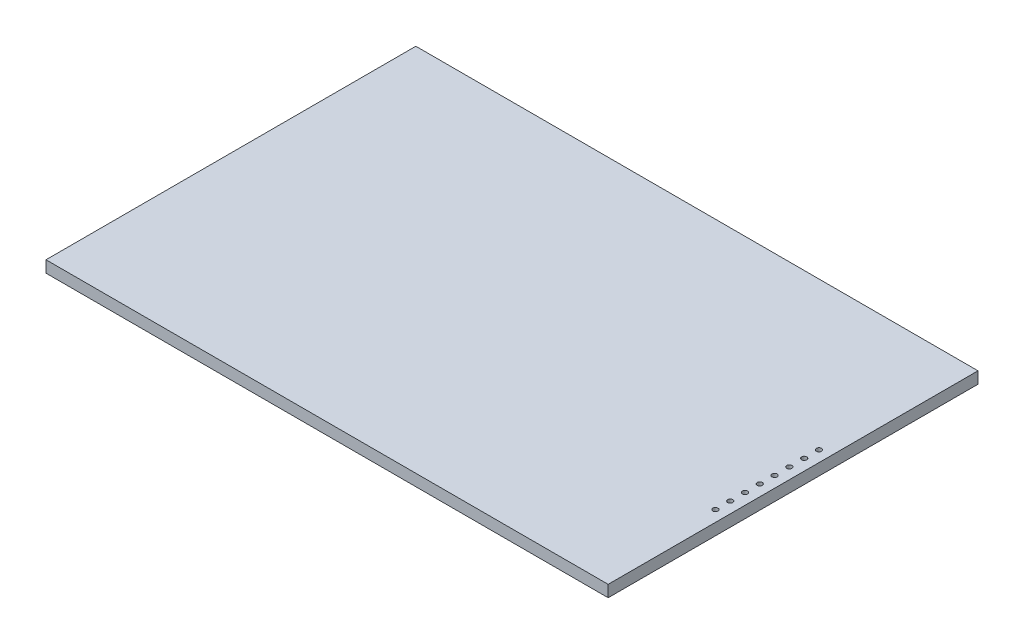
ISO-10303-21;
HEADER;
FILE_DESCRIPTION(('STEP AP214'),'2;1');
FILE_NAME('part.step','',(''),(''),'','','');
FILE_SCHEMA(('AUTOMOTIVE_DESIGN { 1 0 10303 214 1 1 1 1 }'));
ENDSEC;
DATA;
#1=APPLICATION_CONTEXT('core data for automotive mechanical design processes');
#2=APPLICATION_PROTOCOL_DEFINITION('international standard','automotive_design',2000,#1);
#3=PRODUCT_CONTEXT('',#1,'mechanical');
#4=PRODUCT('Part','Part','',(#3));
#5=PRODUCT_RELATED_PRODUCT_CATEGORY('part','',(#4));
#6=PRODUCT_DEFINITION_FORMATION('','',#4);
#7=PRODUCT_DEFINITION_CONTEXT('part definition',#1,'design');
#8=PRODUCT_DEFINITION('design','',#6,#7);
#9=PRODUCT_DEFINITION_SHAPE('','',#8);
#10=(LENGTH_UNIT() NAMED_UNIT(*) SI_UNIT(.MILLI.,.METRE.));
#11=(NAMED_UNIT(*) PLANE_ANGLE_UNIT() SI_UNIT($,.RADIAN.));
#12=(NAMED_UNIT(*) SI_UNIT($,.STERADIAN.) SOLID_ANGLE_UNIT());
#13=UNCERTAINTY_MEASURE_WITH_UNIT(LENGTH_MEASURE(1.E-05),#10,'distance_accuracy_value','');
#14=(GEOMETRIC_REPRESENTATION_CONTEXT(3) GLOBAL_UNCERTAINTY_ASSIGNED_CONTEXT((#13)) GLOBAL_UNIT_ASSIGNED_CONTEXT((#10,
#11,#12)) REPRESENTATION_CONTEXT('',''));
#15=CARTESIAN_POINT('',(0.,0.,0.));
#16=DIRECTION('',(0.,0.,1.));
#17=DIRECTION('',(1.,0.,0.));
#18=AXIS2_PLACEMENT_3D('',#15,#16,#17);
#19=CARTESIAN_POINT('',(0.,2.,0.));
#20=DIRECTION('',(-1.,0.,0.));
#21=DIRECTION('',(0.,0.,1.));
#22=AXIS2_PLACEMENT_3D('',#19,#20,#21);
#23=PLANE('',#22);
#24=DIRECTION('',(0.,0.,-1.));
#25=VECTOR('',#24,1.);
#26=CARTESIAN_POINT('',(0.,0.,0.));
#27=LINE('',#26,#25);
#28=CARTESIAN_POINT('',(0.,0.,0.));
#29=VERTEX_POINT('',#28);
#30=CARTESIAN_POINT('',(0.,0.,-63.5));
#31=VERTEX_POINT('',#30);
#32=EDGE_CURVE('E98',#29,#31,#27,.T.);
#33=ORIENTED_EDGE('',*,*,#32,.T.);
#34=DIRECTION('',(0.,-1.,0.));
#35=VECTOR('',#34,1.);
#36=CARTESIAN_POINT('',(0.,2.,-63.5));
#37=LINE('',#36,#35);
#38=CARTESIAN_POINT('',(0.,2.,-63.5));
#39=VERTEX_POINT('',#38);
#40=EDGE_CURVE('E11',#39,#31,#37,.T.);
#41=ORIENTED_EDGE('',*,*,#40,.F.);
#42=DIRECTION('',(0.,0.,-1.));
#43=VECTOR('',#42,1.);
#44=CARTESIAN_POINT('',(0.,2.,0.));
#45=LINE('',#44,#43);
#46=CARTESIAN_POINT('',(0.,2.,0.));
#47=VERTEX_POINT('',#46);
#48=EDGE_CURVE('E86',#47,#39,#45,.T.);
#49=ORIENTED_EDGE('',*,*,#48,.F.);
#50=DIRECTION('',(0.,-1.,0.));
#51=VECTOR('',#50,1.);
#52=CARTESIAN_POINT('',(0.,2.,0.));
#53=LINE('',#52,#51);
#54=EDGE_CURVE('E94',#47,#29,#53,.T.);
#55=ORIENTED_EDGE('',*,*,#54,.T.);
#56=EDGE_LOOP('',(#33,#41,#49,#55));
#57=FACE_BOUND('',#56,.T.);
#58=ADVANCED_FACE('F35',(#57),#23,.F.);
#59=CARTESIAN_POINT('',(0.,2.,-63.5));
#60=DIRECTION('',(0.,0.,1.));
#61=DIRECTION('',(1.,0.,0.));
#62=AXIS2_PLACEMENT_3D('',#59,#60,#61);
#63=PLANE('',#62);
#64=DIRECTION('',(-1.,0.,0.));
#65=VECTOR('',#64,1.);
#66=CARTESIAN_POINT('',(0.,0.,-63.5));
#67=LINE('',#66,#65);
#68=CARTESIAN_POINT('',(-96.52,0.,-63.5));
#69=VERTEX_POINT('',#68);
#70=EDGE_CURVE('E90',#31,#69,#67,.T.);
#71=ORIENTED_EDGE('',*,*,#70,.T.);
#72=DIRECTION('',(0.,-1.,0.));
#73=VECTOR('',#72,1.);
#74=CARTESIAN_POINT('',(-96.52,2.,-63.5));
#75=LINE('',#74,#73);
#76=CARTESIAN_POINT('',(-96.52,2.,-63.5));
#77=VERTEX_POINT('',#76);
#78=EDGE_CURVE('E43',#77,#69,#75,.T.);
#79=ORIENTED_EDGE('',*,*,#78,.F.);
#80=DIRECTION('',(-1.,0.,0.));
#81=VECTOR('',#80,1.);
#82=CARTESIAN_POINT('',(0.,2.,-63.5));
#83=LINE('',#82,#81);
#84=EDGE_CURVE('E81',#39,#77,#83,.T.);
#85=ORIENTED_EDGE('',*,*,#84,.F.);
#86=ORIENTED_EDGE('',*,*,#40,.T.);
#87=EDGE_LOOP('',(#71,#79,#85,#86));
#88=FACE_BOUND('',#87,.T.);
#89=ADVANCED_FACE('F89',(#88),#63,.F.);
#90=CARTESIAN_POINT('',(-96.52,2.,0.));
#91=DIRECTION('',(1.,0.,0.));
#92=DIRECTION('',(0.,0.,-1.));
#93=AXIS2_PLACEMENT_3D('',#90,#91,#92);
#94=PLANE('',#93);
#95=DIRECTION('',(0.,0.,1.));
#96=VECTOR('',#95,1.);
#97=CARTESIAN_POINT('',(-96.52,0.,0.));
#98=LINE('',#97,#96);
#99=CARTESIAN_POINT('',(-96.52,0.,0.));
#100=VERTEX_POINT('',#99);
#101=EDGE_CURVE('E68',#69,#100,#98,.T.);
#102=ORIENTED_EDGE('',*,*,#101,.T.);
#103=DIRECTION('',(0.,-1.,0.));
#104=VECTOR('',#103,1.);
#105=CARTESIAN_POINT('',(-96.52,2.,0.));
#106=LINE('',#105,#104);
#107=CARTESIAN_POINT('',(-96.52,2.,0.));
#108=VERTEX_POINT('',#107);
#109=EDGE_CURVE('E91',#108,#100,#106,.T.);
#110=ORIENTED_EDGE('',*,*,#109,.F.);
#111=DIRECTION('',(0.,0.,1.));
#112=VECTOR('',#111,1.);
#113=CARTESIAN_POINT('',(-96.52,2.,0.));
#114=LINE('',#113,#112);
#115=EDGE_CURVE('E84',#77,#108,#114,.T.);
#116=ORIENTED_EDGE('',*,*,#115,.F.);
#117=ORIENTED_EDGE('',*,*,#78,.T.);
#118=EDGE_LOOP('',(#102,#110,#116,#117));
#119=FACE_BOUND('',#118,.T.);
#120=ADVANCED_FACE('F92',(#119),#94,.F.);
#121=CARTESIAN_POINT('',(0.,2.,0.));
#122=DIRECTION('',(0.,0.,-1.));
#123=DIRECTION('',(-1.,0.,0.));
#124=AXIS2_PLACEMENT_3D('',#121,#122,#123);
#125=PLANE('',#124);
#126=DIRECTION('',(1.,0.,0.));
#127=VECTOR('',#126,1.);
#128=CARTESIAN_POINT('',(0.,0.,0.));
#129=LINE('',#128,#127);
#130=EDGE_CURVE('E74',#100,#29,#129,.T.);
#131=ORIENTED_EDGE('',*,*,#130,.T.);
#132=ORIENTED_EDGE('',*,*,#54,.F.);
#133=DIRECTION('',(1.,0.,0.));
#134=VECTOR('',#133,1.);
#135=CARTESIAN_POINT('',(0.,2.,0.));
#136=LINE('',#135,#134);
#137=EDGE_CURVE('E51',#108,#47,#136,.T.);
#138=ORIENTED_EDGE('',*,*,#137,.F.);
#139=ORIENTED_EDGE('',*,*,#109,.T.);
#140=EDGE_LOOP('',(#131,#132,#138,#139));
#141=FACE_BOUND('',#140,.T.);
#142=ADVANCED_FACE('F106',(#141),#125,.F.);
#143=CARTESIAN_POINT('',(0.,2.,0.));
#144=DIRECTION('',(0.,1.,0.));
#145=DIRECTION('',(0.,0.,1.));
#146=AXIS2_PLACEMENT_3D('',#143,#144,#145);
#147=PLANE('',#146);
#148=CARTESIAN_POINT('',(-1.90499999999999,2.,-38.1));
#149=DIRECTION('',(0.,1.,0.));
#150=DIRECTION('',(0.,0.,1.));
#151=AXIS2_PLACEMENT_3D('',#148,#149,#150);
#152=CIRCLE('',#151,0.4445);
#153=CARTESIAN_POINT('',(-1.90499999999999,2.,-37.6555));
#154=VERTEX_POINT('',#153);
#155=EDGE_CURVE('E154',#154,#154,#152,.T.);
#156=ORIENTED_EDGE('',*,*,#155,.F.);
#157=EDGE_LOOP('',(#156));
#158=FACE_BOUND('',#157,.T.);
#159=CARTESIAN_POINT('',(-1.90499999999996,2.,-35.56));
#160=DIRECTION('',(0.,1.,0.));
#161=DIRECTION('',(0.,0.,1.));
#162=AXIS2_PLACEMENT_3D('',#159,#160,#161);
#163=CIRCLE('',#162,0.4445);
#164=CARTESIAN_POINT('',(-1.90499999999996,2.,-35.1155));
#165=VERTEX_POINT('',#164);
#166=EDGE_CURVE('E148',#165,#165,#163,.T.);
#167=ORIENTED_EDGE('',*,*,#166,.F.);
#168=EDGE_LOOP('',(#167));
#169=FACE_BOUND('',#168,.T.);
#170=CARTESIAN_POINT('',(-1.90499999999994,2.,-33.02));
#171=DIRECTION('',(0.,1.,0.));
#172=DIRECTION('',(0.,0.,1.));
#173=AXIS2_PLACEMENT_3D('',#170,#171,#172);
#174=CIRCLE('',#173,0.4445);
#175=CARTESIAN_POINT('',(-1.90499999999994,2.,-32.5755));
#176=VERTEX_POINT('',#175);
#177=EDGE_CURVE('E142',#176,#176,#174,.T.);
#178=ORIENTED_EDGE('',*,*,#177,.F.);
#179=EDGE_LOOP('',(#178));
#180=FACE_BOUND('',#179,.T.);
#181=CARTESIAN_POINT('',(-1.90499999999991,2.,-30.48));
#182=DIRECTION('',(0.,1.,0.));
#183=DIRECTION('',(0.,0.,1.));
#184=AXIS2_PLACEMENT_3D('',#181,#182,#183);
#185=CIRCLE('',#184,0.4445);
#186=CARTESIAN_POINT('',(-1.90499999999991,2.,-30.0355));
#187=VERTEX_POINT('',#186);
#188=EDGE_CURVE('E136',#187,#187,#185,.T.);
#189=ORIENTED_EDGE('',*,*,#188,.F.);
#190=EDGE_LOOP('',(#189));
#191=FACE_BOUND('',#190,.T.);
#192=CARTESIAN_POINT('',(-1.90499999999988,2.,-27.94));
#193=DIRECTION('',(0.,1.,0.));
#194=DIRECTION('',(0.,0.,1.));
#195=AXIS2_PLACEMENT_3D('',#192,#193,#194);
#196=CIRCLE('',#195,0.4445);
#197=CARTESIAN_POINT('',(-1.90499999999988,2.,-27.4955));
#198=VERTEX_POINT('',#197);
#199=EDGE_CURVE('E130',#198,#198,#196,.T.);
#200=ORIENTED_EDGE('',*,*,#199,.F.);
#201=EDGE_LOOP('',(#200));
#202=FACE_BOUND('',#201,.T.);
#203=CARTESIAN_POINT('',(-1.90499999999986,2.,-25.4));
#204=DIRECTION('',(0.,1.,0.));
#205=DIRECTION('',(0.,0.,1.));
#206=AXIS2_PLACEMENT_3D('',#203,#204,#205);
#207=CIRCLE('',#206,0.4445);
#208=CARTESIAN_POINT('',(-1.90499999999986,2.,-24.9555));
#209=VERTEX_POINT('',#208);
#210=EDGE_CURVE('E124',#209,#209,#207,.T.);
#211=ORIENTED_EDGE('',*,*,#210,.F.);
#212=EDGE_LOOP('',(#211));
#213=FACE_BOUND('',#212,.T.);
#214=CARTESIAN_POINT('',(-1.90499999999983,2.,-22.86));
#215=DIRECTION('',(0.,1.,0.));
#216=DIRECTION('',(0.,0.,1.));
#217=AXIS2_PLACEMENT_3D('',#214,#215,#216);
#218=CIRCLE('',#217,0.4445);
#219=CARTESIAN_POINT('',(-1.90499999999983,2.,-22.4155));
#220=VERTEX_POINT('',#219);
#221=EDGE_CURVE('E118',#220,#220,#218,.T.);
#222=ORIENTED_EDGE('',*,*,#221,.F.);
#223=EDGE_LOOP('',(#222));
#224=FACE_BOUND('',#223,.T.);
#225=CARTESIAN_POINT('',(-1.9049999999998,2.,-20.32));
#226=DIRECTION('',(0.,1.,0.));
#227=DIRECTION('',(0.,0.,1.));
#228=AXIS2_PLACEMENT_3D('',#225,#226,#227);
#229=CIRCLE('',#228,0.4445);
#230=CARTESIAN_POINT('',(-1.9049999999998,2.,-19.8755));
#231=VERTEX_POINT('',#230);
#232=EDGE_CURVE('E112',#231,#231,#229,.T.);
#233=ORIENTED_EDGE('',*,*,#232,.F.);
#234=EDGE_LOOP('',(#233));
#235=FACE_BOUND('',#234,.T.);
#236=ORIENTED_EDGE('',*,*,#48,.T.);
#237=ORIENTED_EDGE('',*,*,#84,.T.);
#238=ORIENTED_EDGE('',*,*,#115,.T.);
#239=ORIENTED_EDGE('',*,*,#137,.T.);
#240=EDGE_LOOP('',(#236,#237,#238,#239));
#241=FACE_BOUND('',#240,.T.);
#242=ADVANCED_FACE('F82',(#158,#169,#180,#191,#202,#213,#224,#235,#241),#147,.T.);
#243=CARTESIAN_POINT('',(0.,0.,0.));
#244=DIRECTION('',(0.,1.,0.));
#245=DIRECTION('',(0.,0.,1.));
#246=AXIS2_PLACEMENT_3D('',#243,#244,#245);
#247=PLANE('',#246);
#248=CARTESIAN_POINT('',(-1.90499999999999,0.,-38.1));
#249=DIRECTION('',(0.,1.,0.));
#250=DIRECTION('',(0.,0.,1.));
#251=AXIS2_PLACEMENT_3D('',#248,#249,#250);
#252=CIRCLE('',#251,0.4445);
#253=CARTESIAN_POINT('',(-1.90499999999999,0.,-37.6555));
#254=VERTEX_POINT('',#253);
#255=EDGE_CURVE('E101',#254,#254,#252,.T.);
#256=ORIENTED_EDGE('',*,*,#255,.T.);
#257=EDGE_LOOP('',(#256));
#258=FACE_BOUND('',#257,.T.);
#259=CARTESIAN_POINT('',(-1.90499999999996,0.,-35.56));
#260=DIRECTION('',(0.,1.,0.));
#261=DIRECTION('',(0.,0.,1.));
#262=AXIS2_PLACEMENT_3D('',#259,#260,#261);
#263=CIRCLE('',#262,0.4445);
#264=CARTESIAN_POINT('',(-1.90499999999996,0.,-35.1155));
#265=VERTEX_POINT('',#264);
#266=EDGE_CURVE('E151',#265,#265,#263,.T.);
#267=ORIENTED_EDGE('',*,*,#266,.T.);
#268=EDGE_LOOP('',(#267));
#269=FACE_BOUND('',#268,.T.);
#270=CARTESIAN_POINT('',(-1.90499999999994,0.,-33.02));
#271=DIRECTION('',(0.,1.,0.));
#272=DIRECTION('',(0.,0.,1.));
#273=AXIS2_PLACEMENT_3D('',#270,#271,#272);
#274=CIRCLE('',#273,0.4445);
#275=CARTESIAN_POINT('',(-1.90499999999994,0.,-32.5755));
#276=VERTEX_POINT('',#275);
#277=EDGE_CURVE('E145',#276,#276,#274,.T.);
#278=ORIENTED_EDGE('',*,*,#277,.T.);
#279=EDGE_LOOP('',(#278));
#280=FACE_BOUND('',#279,.T.);
#281=CARTESIAN_POINT('',(-1.90499999999991,0.,-30.48));
#282=DIRECTION('',(0.,1.,0.));
#283=DIRECTION('',(0.,0.,1.));
#284=AXIS2_PLACEMENT_3D('',#281,#282,#283);
#285=CIRCLE('',#284,0.4445);
#286=CARTESIAN_POINT('',(-1.90499999999991,0.,-30.0355));
#287=VERTEX_POINT('',#286);
#288=EDGE_CURVE('E139',#287,#287,#285,.T.);
#289=ORIENTED_EDGE('',*,*,#288,.T.);
#290=EDGE_LOOP('',(#289));
#291=FACE_BOUND('',#290,.T.);
#292=CARTESIAN_POINT('',(-1.90499999999988,0.,-27.94));
#293=DIRECTION('',(0.,1.,0.));
#294=DIRECTION('',(0.,0.,1.));
#295=AXIS2_PLACEMENT_3D('',#292,#293,#294);
#296=CIRCLE('',#295,0.4445);
#297=CARTESIAN_POINT('',(-1.90499999999988,0.,-27.4955));
#298=VERTEX_POINT('',#297);
#299=EDGE_CURVE('E133',#298,#298,#296,.T.);
#300=ORIENTED_EDGE('',*,*,#299,.T.);
#301=EDGE_LOOP('',(#300));
#302=FACE_BOUND('',#301,.T.);
#303=CARTESIAN_POINT('',(-1.90499999999986,0.,-25.4));
#304=DIRECTION('',(0.,1.,0.));
#305=DIRECTION('',(0.,0.,1.));
#306=AXIS2_PLACEMENT_3D('',#303,#304,#305);
#307=CIRCLE('',#306,0.4445);
#308=CARTESIAN_POINT('',(-1.90499999999986,0.,-24.9555));
#309=VERTEX_POINT('',#308);
#310=EDGE_CURVE('E127',#309,#309,#307,.T.);
#311=ORIENTED_EDGE('',*,*,#310,.T.);
#312=EDGE_LOOP('',(#311));
#313=FACE_BOUND('',#312,.T.);
#314=CARTESIAN_POINT('',(-1.90499999999983,0.,-22.86));
#315=DIRECTION('',(0.,1.,0.));
#316=DIRECTION('',(0.,0.,1.));
#317=AXIS2_PLACEMENT_3D('',#314,#315,#316);
#318=CIRCLE('',#317,0.4445);
#319=CARTESIAN_POINT('',(-1.90499999999983,0.,-22.4155));
#320=VERTEX_POINT('',#319);
#321=EDGE_CURVE('E121',#320,#320,#318,.T.);
#322=ORIENTED_EDGE('',*,*,#321,.T.);
#323=EDGE_LOOP('',(#322));
#324=FACE_BOUND('',#323,.T.);
#325=CARTESIAN_POINT('',(-1.9049999999998,0.,-20.32));
#326=DIRECTION('',(0.,1.,0.));
#327=DIRECTION('',(0.,0.,1.));
#328=AXIS2_PLACEMENT_3D('',#325,#326,#327);
#329=CIRCLE('',#328,0.4445);
#330=CARTESIAN_POINT('',(-1.9049999999998,0.,-19.8755));
#331=VERTEX_POINT('',#330);
#332=EDGE_CURVE('E115',#331,#331,#329,.T.);
#333=ORIENTED_EDGE('',*,*,#332,.T.);
#334=EDGE_LOOP('',(#333));
#335=FACE_BOUND('',#334,.T.);
#336=ORIENTED_EDGE('',*,*,#32,.F.);
#337=ORIENTED_EDGE('',*,*,#130,.F.);
#338=ORIENTED_EDGE('',*,*,#101,.F.);
#339=ORIENTED_EDGE('',*,*,#70,.F.);
#340=EDGE_LOOP('',(#336,#337,#338,#339));
#341=FACE_BOUND('',#340,.T.);
#342=ADVANCED_FACE('F109',(#258,#269,#280,#291,#302,#313,#324,#335,#341),#247,.F.);
#343=CARTESIAN_POINT('',(-1.9049999999998,0.,-20.32));
#344=DIRECTION('',(0.,1.,0.));
#345=DIRECTION('',(0.,0.,1.));
#346=AXIS2_PLACEMENT_3D('',#343,#344,#345);
#347=CYLINDRICAL_SURFACE('',#346,0.4445);
#348=ORIENTED_EDGE('',*,*,#332,.F.);
#349=EDGE_LOOP('',(#348));
#350=FACE_BOUND('',#349,.T.);
#351=ORIENTED_EDGE('',*,*,#232,.T.);
#352=EDGE_LOOP('',(#351));
#353=FACE_BOUND('',#352,.T.);
#354=ADVANCED_FACE('F186',(#350,#353),#347,.F.);
#355=CARTESIAN_POINT('',(-1.90499999999983,0.,-22.86));
#356=DIRECTION('',(0.,1.,0.));
#357=DIRECTION('',(0.,0.,1.));
#358=AXIS2_PLACEMENT_3D('',#355,#356,#357);
#359=CYLINDRICAL_SURFACE('',#358,0.4445);
#360=ORIENTED_EDGE('',*,*,#321,.F.);
#361=EDGE_LOOP('',(#360));
#362=FACE_BOUND('',#361,.T.);
#363=ORIENTED_EDGE('',*,*,#221,.T.);
#364=EDGE_LOOP('',(#363));
#365=FACE_BOUND('',#364,.T.);
#366=ADVANCED_FACE('F188',(#362,#365),#359,.F.);
#367=CARTESIAN_POINT('',(-1.90499999999986,0.,-25.4));
#368=DIRECTION('',(0.,1.,0.));
#369=DIRECTION('',(0.,0.,1.));
#370=AXIS2_PLACEMENT_3D('',#367,#368,#369);
#371=CYLINDRICAL_SURFACE('',#370,0.4445);
#372=ORIENTED_EDGE('',*,*,#310,.F.);
#373=EDGE_LOOP('',(#372));
#374=FACE_BOUND('',#373,.T.);
#375=ORIENTED_EDGE('',*,*,#210,.T.);
#376=EDGE_LOOP('',(#375));
#377=FACE_BOUND('',#376,.T.);
#378=ADVANCED_FACE('F195',(#374,#377),#371,.F.);
#379=CARTESIAN_POINT('',(-1.90499999999988,0.,-27.94));
#380=DIRECTION('',(0.,1.,0.));
#381=DIRECTION('',(0.,0.,1.));
#382=AXIS2_PLACEMENT_3D('',#379,#380,#381);
#383=CYLINDRICAL_SURFACE('',#382,0.4445);
#384=ORIENTED_EDGE('',*,*,#299,.F.);
#385=EDGE_LOOP('',(#384));
#386=FACE_BOUND('',#385,.T.);
#387=ORIENTED_EDGE('',*,*,#199,.T.);
#388=EDGE_LOOP('',(#387));
#389=FACE_BOUND('',#388,.T.);
#390=ADVANCED_FACE('F243',(#386,#389),#383,.F.);
#391=CARTESIAN_POINT('',(-1.90499999999991,0.,-30.48));
#392=DIRECTION('',(0.,1.,0.));
#393=DIRECTION('',(0.,0.,1.));
#394=AXIS2_PLACEMENT_3D('',#391,#392,#393);
#395=CYLINDRICAL_SURFACE('',#394,0.4445);
#396=ORIENTED_EDGE('',*,*,#288,.F.);
#397=EDGE_LOOP('',(#396));
#398=FACE_BOUND('',#397,.T.);
#399=ORIENTED_EDGE('',*,*,#188,.T.);
#400=EDGE_LOOP('',(#399));
#401=FACE_BOUND('',#400,.T.);
#402=ADVANCED_FACE('F253',(#398,#401),#395,.F.);
#403=CARTESIAN_POINT('',(-1.90499999999994,0.,-33.02));
#404=DIRECTION('',(0.,1.,0.));
#405=DIRECTION('',(0.,0.,1.));
#406=AXIS2_PLACEMENT_3D('',#403,#404,#405);
#407=CYLINDRICAL_SURFACE('',#406,0.4445);
#408=ORIENTED_EDGE('',*,*,#277,.F.);
#409=EDGE_LOOP('',(#408));
#410=FACE_BOUND('',#409,.T.);
#411=ORIENTED_EDGE('',*,*,#177,.T.);
#412=EDGE_LOOP('',(#411));
#413=FACE_BOUND('',#412,.T.);
#414=ADVANCED_FACE('F263',(#410,#413),#407,.F.);
#415=CARTESIAN_POINT('',(-1.90499999999996,0.,-35.56));
#416=DIRECTION('',(0.,1.,0.));
#417=DIRECTION('',(0.,0.,1.));
#418=AXIS2_PLACEMENT_3D('',#415,#416,#417);
#419=CYLINDRICAL_SURFACE('',#418,0.4445);
#420=ORIENTED_EDGE('',*,*,#266,.F.);
#421=EDGE_LOOP('',(#420));
#422=FACE_BOUND('',#421,.T.);
#423=ORIENTED_EDGE('',*,*,#166,.T.);
#424=EDGE_LOOP('',(#423));
#425=FACE_BOUND('',#424,.T.);
#426=ADVANCED_FACE('F165',(#422,#425),#419,.F.);
#427=CARTESIAN_POINT('',(-1.90499999999999,0.,-38.1));
#428=DIRECTION('',(0.,1.,0.));
#429=DIRECTION('',(0.,0.,1.));
#430=AXIS2_PLACEMENT_3D('',#427,#428,#429);
#431=CYLINDRICAL_SURFACE('',#430,0.4445);
#432=ORIENTED_EDGE('',*,*,#255,.F.);
#433=EDGE_LOOP('',(#432));
#434=FACE_BOUND('',#433,.T.);
#435=ORIENTED_EDGE('',*,*,#155,.T.);
#436=EDGE_LOOP('',(#435));
#437=FACE_BOUND('',#436,.T.);
#438=ADVANCED_FACE('F162',(#434,#437),#431,.F.);
#439=CLOSED_SHELL('',(#58,#89,#120,#142,#242,#342,#354,#366,#378,#390,#402,#414,#426,#438));
#440=MANIFOLD_SOLID_BREP('B2',#439);
#441=ADVANCED_BREP_SHAPE_REPRESENTATION('',(#18,#440),#14);
#442=SHAPE_DEFINITION_REPRESENTATION(#9,#441);
ENDSEC;
END-ISO-10303-21;
